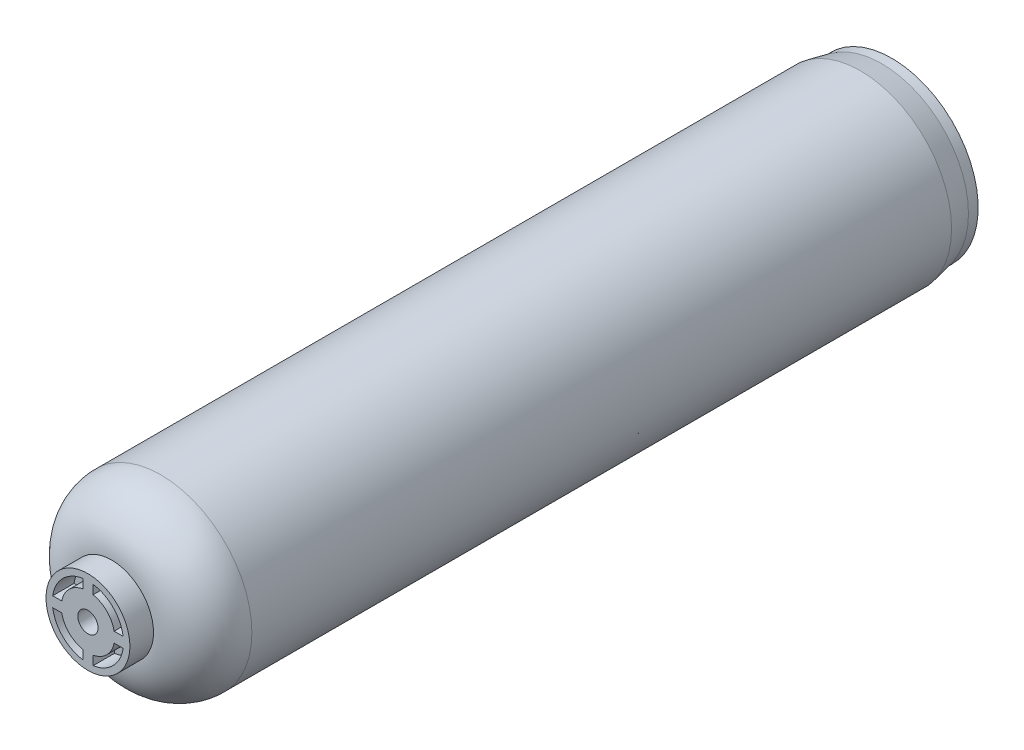
ISO-10303-21;
HEADER;
FILE_DESCRIPTION(('STEP AP214'),'2;1');
FILE_NAME('part.step','',(''),(''),'','','');
FILE_SCHEMA(('AUTOMOTIVE_DESIGN { 1 0 10303 214 1 1 1 1 }'));
ENDSEC;
DATA;
#1=APPLICATION_CONTEXT('core data for automotive mechanical design processes');
#2=APPLICATION_PROTOCOL_DEFINITION('international standard','automotive_design',2000,#1);
#3=PRODUCT_CONTEXT('',#1,'mechanical');
#4=PRODUCT('Part','Part','',(#3));
#5=PRODUCT_RELATED_PRODUCT_CATEGORY('part','',(#4));
#6=PRODUCT_DEFINITION_FORMATION('','',#4);
#7=PRODUCT_DEFINITION_CONTEXT('part definition',#1,'design');
#8=PRODUCT_DEFINITION('design','',#6,#7);
#9=PRODUCT_DEFINITION_SHAPE('','',#8);
#10=(LENGTH_UNIT() NAMED_UNIT(*) SI_UNIT(.MILLI.,.METRE.));
#11=(NAMED_UNIT(*) PLANE_ANGLE_UNIT() SI_UNIT($,.RADIAN.));
#12=(NAMED_UNIT(*) SI_UNIT($,.STERADIAN.) SOLID_ANGLE_UNIT());
#13=UNCERTAINTY_MEASURE_WITH_UNIT(LENGTH_MEASURE(1.E-05),#10,'distance_accuracy_value','');
#14=(GEOMETRIC_REPRESENTATION_CONTEXT(3) GLOBAL_UNCERTAINTY_ASSIGNED_CONTEXT((#13)) GLOBAL_UNIT_ASSIGNED_CONTEXT((#10,
#11,#12)) REPRESENTATION_CONTEXT('',''));
#15=CARTESIAN_POINT('',(0.,0.,0.));
#16=DIRECTION('',(0.,0.,1.));
#17=DIRECTION('',(1.,0.,0.));
#18=AXIS2_PLACEMENT_3D('',#15,#16,#17);
#19=CARTESIAN_POINT('',(0.,28.194,-273.742032584598));
#20=DIRECTION('',(0.,0.,-1.));
#21=DIRECTION('',(-1.,0.,0.));
#22=AXIS2_PLACEMENT_3D('',#19,#20,#21);
#23=PLANE('',#22);
#24=CARTESIAN_POINT('',(0.,0.,-273.742032584598));
#25=DIRECTION('',(0.,0.,-1.));
#26=DIRECTION('',(-1.,0.,0.));
#27=AXIS2_PLACEMENT_3D('',#24,#25,#26);
#28=CIRCLE('',#27,28.194);
#29=CARTESIAN_POINT('',(-28.194,0.,-273.742032584598));
#30=VERTEX_POINT('',#29);
#31=EDGE_CURVE('E316',#30,#30,#28,.T.);
#32=ORIENTED_EDGE('',*,*,#31,.T.);
#33=EDGE_LOOP('',(#32));
#34=FACE_BOUND('',#33,.T.);
#35=CARTESIAN_POINT('',(0.,0.,-273.742032584598));
#36=DIRECTION('',(0.,0.,-1.));
#37=DIRECTION('',(-1.,0.,0.));
#38=AXIS2_PLACEMENT_3D('',#35,#36,#37);
#39=CIRCLE('',#38,28.575);
#40=CARTESIAN_POINT('',(-28.575,0.,-273.742032584598));
#41=VERTEX_POINT('',#40);
#42=EDGE_CURVE('E313',#41,#41,#39,.F.);
#43=ORIENTED_EDGE('',*,*,#42,.T.);
#44=EDGE_LOOP('',(#43));
#45=FACE_BOUND('',#44,.T.);
#46=ADVANCED_FACE('F17',(#34,#45),#23,.F.);
#47=CARTESIAN_POINT('',(0.,0.,0.));
#48=DIRECTION('',(0.,0.,-1.));
#49=DIRECTION('',(-1.,0.,0.));
#50=AXIS2_PLACEMENT_3D('',#47,#48,#49);
#51=CYLINDRICAL_SURFACE('',#50,28.194);
#52=CARTESIAN_POINT('',(0.,0.,-279.584032584598));
#53=DIRECTION('',(0.,0.,-1.));
#54=DIRECTION('',(-1.,0.,0.));
#55=AXIS2_PLACEMENT_3D('',#52,#53,#54);
#56=CIRCLE('',#55,28.194);
#57=CARTESIAN_POINT('',(-28.194,0.,-279.584032584598));
#58=VERTEX_POINT('',#57);
#59=EDGE_CURVE('E310',#58,#58,#56,.T.);
#60=ORIENTED_EDGE('',*,*,#59,.T.);
#61=EDGE_LOOP('',(#60));
#62=FACE_BOUND('',#61,.T.);
#63=ORIENTED_EDGE('',*,*,#31,.F.);
#64=EDGE_LOOP('',(#63));
#65=FACE_BOUND('',#64,.T.);
#66=ADVANCED_FACE('F322',(#62,#65),#51,.F.);
#67=CARTESIAN_POINT('',(0.,0.,0.));
#68=DIRECTION('',(0.,0.,-1.));
#69=DIRECTION('',(-1.,0.,0.));
#70=AXIS2_PLACEMENT_3D('',#67,#68,#69);
#71=CYLINDRICAL_SURFACE('',#70,28.575);
#72=ORIENTED_EDGE('',*,*,#42,.F.);
#73=EDGE_LOOP('',(#72));
#74=FACE_BOUND('',#73,.T.);
#75=CARTESIAN_POINT('',(0.,0.,-271.329032584598));
#76=DIRECTION('',(0.,0.,-1.));
#77=DIRECTION('',(-1.,0.,0.));
#78=AXIS2_PLACEMENT_3D('',#75,#76,#77);
#79=CIRCLE('',#78,28.575);
#80=CARTESIAN_POINT('',(-28.575,0.,-271.329032584598));
#81=VERTEX_POINT('',#80);
#82=EDGE_CURVE('E307',#81,#81,#79,.F.);
#83=ORIENTED_EDGE('',*,*,#82,.T.);
#84=EDGE_LOOP('',(#83));
#85=FACE_BOUND('',#84,.T.);
#86=ADVANCED_FACE('F324',(#74,#85),#71,.F.);
#87=CARTESIAN_POINT('',(0.,28.575,-279.584032584598));
#88=DIRECTION('',(0.,0.,1.));
#89=DIRECTION('',(1.,0.,0.));
#90=AXIS2_PLACEMENT_3D('',#87,#88,#89);
#91=PLANE('',#90);
#92=ORIENTED_EDGE('',*,*,#59,.F.);
#93=EDGE_LOOP('',(#92));
#94=FACE_BOUND('',#93,.T.);
#95=CARTESIAN_POINT('',(0.,0.,-279.584032584598));
#96=DIRECTION('',(0.,0.,-1.));
#97=DIRECTION('',(-1.,0.,0.));
#98=AXIS2_PLACEMENT_3D('',#95,#96,#97);
#99=CIRCLE('',#98,28.575);
#100=CARTESIAN_POINT('',(-28.575,0.,-279.584032584598));
#101=VERTEX_POINT('',#100);
#102=EDGE_CURVE('E304',#101,#101,#99,.T.);
#103=ORIENTED_EDGE('',*,*,#102,.T.);
#104=EDGE_LOOP('',(#103));
#105=FACE_BOUND('',#104,.T.);
#106=ADVANCED_FACE('F331',(#94,#105),#91,.F.);
#107=CARTESIAN_POINT('',(0.,28.575,-271.329032584598));
#108=DIRECTION('',(0.,0.,1.));
#109=DIRECTION('',(1.,0.,0.));
#110=AXIS2_PLACEMENT_3D('',#107,#108,#109);
#111=PLANE('',#110);
#112=CARTESIAN_POINT('',(0.,0.,-271.329032584598));
#113=DIRECTION('',(0.,0.,-1.));
#114=DIRECTION('',(-1.,0.,0.));
#115=AXIS2_PLACEMENT_3D('',#112,#113,#114);
#116=CIRCLE('',#115,28.194);
#117=CARTESIAN_POINT('',(-28.194,0.,-271.329032584598));
#118=VERTEX_POINT('',#117);
#119=EDGE_CURVE('E301',#118,#118,#116,.F.);
#120=ORIENTED_EDGE('',*,*,#119,.T.);
#121=EDGE_LOOP('',(#120));
#122=FACE_BOUND('',#121,.T.);
#123=ORIENTED_EDGE('',*,*,#82,.F.);
#124=EDGE_LOOP('',(#123));
#125=FACE_BOUND('',#124,.T.);
#126=ADVANCED_FACE('F520',(#122,#125),#111,.F.);
#127=CARTESIAN_POINT('',(0.,0.,0.));
#128=DIRECTION('',(0.,0.,-1.));
#129=DIRECTION('',(-1.,0.,0.));
#130=AXIS2_PLACEMENT_3D('',#127,#128,#129);
#131=CYLINDRICAL_SURFACE('',#130,28.575);
#132=CARTESIAN_POINT('',(0.,0.,-283.648032584598));
#133=DIRECTION('',(0.,0.,-1.));
#134=DIRECTION('',(-1.,0.,0.));
#135=AXIS2_PLACEMENT_3D('',#132,#133,#134);
#136=CIRCLE('',#135,28.575);
#137=CARTESIAN_POINT('',(-28.575,0.,-283.648032584598));
#138=VERTEX_POINT('',#137);
#139=EDGE_CURVE('E239',#138,#138,#136,.T.);
#140=ORIENTED_EDGE('',*,*,#139,.T.);
#141=EDGE_LOOP('',(#140));
#142=FACE_BOUND('',#141,.T.);
#143=ORIENTED_EDGE('',*,*,#102,.F.);
#144=EDGE_LOOP('',(#143));
#145=FACE_BOUND('',#144,.T.);
#146=ADVANCED_FACE('F514',(#142,#145),#131,.F.);
#147=CARTESIAN_POINT('',(0.,0.,0.));
#148=DIRECTION('',(0.,0.,-1.));
#149=DIRECTION('',(-1.,0.,0.));
#150=AXIS2_PLACEMENT_3D('',#147,#148,#149);
#151=CYLINDRICAL_SURFACE('',#150,28.194);
#152=ORIENTED_EDGE('',*,*,#119,.F.);
#153=EDGE_LOOP('',(#152));
#154=FACE_BOUND('',#153,.T.);
#155=CARTESIAN_POINT('',(0.,0.,-25.9842));
#156=DIRECTION('',(0.,0.,1.));
#157=DIRECTION('',(1.,0.,0.));
#158=AXIS2_PLACEMENT_3D('',#155,#156,#157);
#159=CIRCLE('',#158,28.194);
#160=CARTESIAN_POINT('',(28.194,0.,-25.9842));
#161=VERTEX_POINT('',#160);
#162=EDGE_CURVE('E231',#161,#161,#159,.T.);
#163=ORIENTED_EDGE('',*,*,#162,.T.);
#164=EDGE_LOOP('',(#163));
#165=FACE_BOUND('',#164,.T.);
#166=ADVANCED_FACE('F509',(#154,#165),#151,.F.);
#167=CARTESIAN_POINT('',(0.,29.5275,-283.648032584598));
#168=DIRECTION('',(0.,0.,1.));
#169=DIRECTION('',(1.,0.,0.));
#170=AXIS2_PLACEMENT_3D('',#167,#168,#169);
#171=PLANE('',#170);
#172=ORIENTED_EDGE('',*,*,#139,.F.);
#173=EDGE_LOOP('',(#172));
#174=FACE_BOUND('',#173,.T.);
#175=CARTESIAN_POINT('',(0.,0.,-283.648032584598));
#176=DIRECTION('',(0.,0.,-1.));
#177=DIRECTION('',(-1.,0.,0.));
#178=AXIS2_PLACEMENT_3D('',#175,#176,#177);
#179=CIRCLE('',#178,29.5275);
#180=CARTESIAN_POINT('',(-29.5275,0.,-283.648032584598));
#181=VERTEX_POINT('',#180);
#182=EDGE_CURVE('E152',#181,#181,#179,.T.);
#183=ORIENTED_EDGE('',*,*,#182,.T.);
#184=EDGE_LOOP('',(#183));
#185=FACE_BOUND('',#184,.T.);
#186=ADVANCED_FACE('F223',(#174,#185),#171,.F.);
#187=CARTESIAN_POINT('',(0.,0.,-25.9842));
#188=DIRECTION('',(0.,0.,1.));
#189=DIRECTION('',(1.,0.,0.));
#190=AXIS2_PLACEMENT_3D('',#187,#188,#189);
#191=TOROIDAL_SURFACE('',#190,14.9606,13.2334);
#192=ORIENTED_EDGE('',*,*,#162,.F.);
#193=EDGE_LOOP('',(#192));
#194=FACE_BOUND('',#193,.T.);
#195=CARTESIAN_POINT('',(0.,0.,-12.7508));
#196=DIRECTION('',(0.,0.,1.));
#197=DIRECTION('',(-1.,0.,0.));
#198=AXIS2_PLACEMENT_3D('',#195,#196,#197);
#199=CIRCLE('',#198,14.9606);
#200=CARTESIAN_POINT('',(-14.9606,0.,-12.7508));
#201=VERTEX_POINT('',#200);
#202=CARTESIAN_POINT('',(14.9606,0.,-12.7508));
#203=VERTEX_POINT('',#202);
#204=EDGE_CURVE('E139',#201,#203,#199,.T.);
#205=ORIENTED_EDGE('',*,*,#204,.T.);
#206=CARTESIAN_POINT('',(0.,0.,-12.7508));
#207=DIRECTION('',(0.,0.,1.));
#208=DIRECTION('',(1.,0.,0.));
#209=AXIS2_PLACEMENT_3D('',#206,#207,#208);
#210=CIRCLE('',#209,14.9606);
#211=EDGE_CURVE('E142',#203,#201,#210,.T.);
#212=ORIENTED_EDGE('',*,*,#211,.T.);
#213=EDGE_LOOP('',(#205,#212));
#214=FACE_BOUND('',#213,.T.);
#215=ADVANCED_FACE('F144',(#194,#214),#191,.F.);
#216=CARTESIAN_POINT('',(0.,0.,0.));
#217=DIRECTION('',(0.,0.,-1.));
#218=DIRECTION('',(-1.,0.,0.));
#219=AXIS2_PLACEMENT_3D('',#216,#217,#218);
#220=CYLINDRICAL_SURFACE('',#219,29.5275);
#221=CARTESIAN_POINT('',(0.,0.,-286.823032584598));
#222=DIRECTION('',(0.,0.,1.));
#223=DIRECTION('',(1.,0.,0.));
#224=AXIS2_PLACEMENT_3D('',#221,#222,#223);
#225=CIRCLE('',#224,29.5275);
#226=CARTESIAN_POINT('',(29.5275,0.,-286.823032584598));
#227=VERTEX_POINT('',#226);
#228=EDGE_CURVE('E147',#227,#227,#225,.T.);
#229=ORIENTED_EDGE('',*,*,#228,.F.);
#230=EDGE_LOOP('',(#229));
#231=FACE_BOUND('',#230,.T.);
#232=ORIENTED_EDGE('',*,*,#182,.F.);
#233=EDGE_LOOP('',(#232));
#234=FACE_BOUND('',#233,.T.);
#235=ADVANCED_FACE('F222',(#231,#234),#220,.F.);
#236=CARTESIAN_POINT('',(0.,0.,-7.62));
#237=DIRECTION('',(0.,0.,1.));
#238=DIRECTION('',(1.,0.,0.));
#239=AXIS2_PLACEMENT_3D('',#236,#237,#238);
#240=PLANE('',#239);
#241=CARTESIAN_POINT('',(0.,0.,-7.62));
#242=DIRECTION('',(0.,0.,-1.));
#243=DIRECTION('',(-1.,0.,0.));
#244=AXIS2_PLACEMENT_3D('',#241,#242,#243);
#245=CIRCLE('',#244,9.525);
#246=CARTESIAN_POINT('',(9.34529307994137,1.8415,-7.62));
#247=VERTEX_POINT('',#246);
#248=CARTESIAN_POINT('',(1.8415,9.34529307994136,-7.62));
#249=VERTEX_POINT('',#248);
#250=EDGE_CURVE('E132',#247,#249,#245,.F.);
#251=ORIENTED_EDGE('',*,*,#250,.F.);
#252=DIRECTION('',(1.,0.,0.));
#253=VECTOR('',#252,1.);
#254=CARTESIAN_POINT('',(9.34529307994137,1.8415,-7.62));
#255=LINE('',#254,#253);
#256=CARTESIAN_POINT('',(12.5657820190388,1.8415,-7.62));
#257=VERTEX_POINT('',#256);
#258=EDGE_CURVE('E212',#247,#257,#255,.T.);
#259=ORIENTED_EDGE('',*,*,#258,.T.);
#260=CARTESIAN_POINT('',(0.,0.,-7.62));
#261=DIRECTION('',(0.,0.,-1.));
#262=DIRECTION('',(-1.,0.,0.));
#263=AXIS2_PLACEMENT_3D('',#260,#261,#262);
#264=CIRCLE('',#263,12.7);
#265=CARTESIAN_POINT('',(1.8415,12.5657820190388,-7.62));
#266=VERTEX_POINT('',#265);
#267=EDGE_CURVE('E294',#257,#266,#264,.F.);
#268=ORIENTED_EDGE('',*,*,#267,.T.);
#269=DIRECTION('',(0.,1.,0.));
#270=VECTOR('',#269,1.);
#271=CARTESIAN_POINT('',(1.8415,12.5657820190388,-7.62));
#272=LINE('',#271,#270);
#273=EDGE_CURVE('E208',#266,#249,#272,.F.);
#274=ORIENTED_EDGE('',*,*,#273,.T.);
#275=EDGE_LOOP('',(#251,#259,#268,#274));
#276=FACE_BOUND('',#275,.T.);
#277=ADVANCED_FACE('F400',(#276),#240,.T.);
#278=CARTESIAN_POINT('',(0.,0.,-7.62));
#279=DIRECTION('',(0.,0.,1.));
#280=DIRECTION('',(1.,0.,0.));
#281=AXIS2_PLACEMENT_3D('',#278,#279,#280);
#282=PLANE('',#281);
#283=CARTESIAN_POINT('',(0.,0.,-7.62));
#284=DIRECTION('',(0.,0.,-1.));
#285=DIRECTION('',(-1.,0.,0.));
#286=AXIS2_PLACEMENT_3D('',#283,#284,#285);
#287=CIRCLE('',#286,9.525);
#288=CARTESIAN_POINT('',(1.8415,-9.34529307994136,-7.62));
#289=VERTEX_POINT('',#288);
#290=CARTESIAN_POINT('',(9.34529307994137,-1.8415,-7.62));
#291=VERTEX_POINT('',#290);
#292=EDGE_CURVE('E291',#289,#291,#287,.F.);
#293=ORIENTED_EDGE('',*,*,#292,.F.);
#294=DIRECTION('',(0.,-1.,0.));
#295=VECTOR('',#294,1.);
#296=CARTESIAN_POINT('',(1.8415,-9.34529307994136,-7.62));
#297=LINE('',#296,#295);
#298=CARTESIAN_POINT('',(1.84150000000001,-12.5657820190388,-7.62));
#299=VERTEX_POINT('',#298);
#300=EDGE_CURVE('E204',#289,#299,#297,.T.);
#301=ORIENTED_EDGE('',*,*,#300,.T.);
#302=CARTESIAN_POINT('',(0.,0.,-7.62));
#303=DIRECTION('',(0.,0.,-1.));
#304=DIRECTION('',(-1.,0.,0.));
#305=AXIS2_PLACEMENT_3D('',#302,#303,#304);
#306=CIRCLE('',#305,12.7);
#307=CARTESIAN_POINT('',(12.5657820190388,-1.8415,-7.62));
#308=VERTEX_POINT('',#307);
#309=EDGE_CURVE('E289',#299,#308,#306,.F.);
#310=ORIENTED_EDGE('',*,*,#309,.T.);
#311=DIRECTION('',(1.,0.,0.));
#312=VECTOR('',#311,1.);
#313=CARTESIAN_POINT('',(9.34529307994137,-1.8415,-7.62));
#314=LINE('',#313,#312);
#315=EDGE_CURVE('E200',#308,#291,#314,.F.);
#316=ORIENTED_EDGE('',*,*,#315,.T.);
#317=EDGE_LOOP('',(#293,#301,#310,#316));
#318=FACE_BOUND('',#317,.T.);
#319=ADVANCED_FACE('F579',(#318),#282,.T.);
#320=CARTESIAN_POINT('',(0.,0.,-7.62));
#321=DIRECTION('',(0.,0.,1.));
#322=DIRECTION('',(1.,0.,0.));
#323=AXIS2_PLACEMENT_3D('',#320,#321,#322);
#324=PLANE('',#323);
#325=CARTESIAN_POINT('',(0.,0.,-7.62));
#326=DIRECTION('',(0.,0.,-1.));
#327=DIRECTION('',(-1.,0.,0.));
#328=AXIS2_PLACEMENT_3D('',#325,#326,#327);
#329=CIRCLE('',#328,12.7);
#330=CARTESIAN_POINT('',(-12.5657820190388,-1.8415,-7.62));
#331=VERTEX_POINT('',#330);
#332=CARTESIAN_POINT('',(-1.8415,-12.5657820190388,-7.62));
#333=VERTEX_POINT('',#332);
#334=EDGE_CURVE('E287',#331,#333,#329,.F.);
#335=ORIENTED_EDGE('',*,*,#334,.T.);
#336=DIRECTION('',(0.,1.,0.));
#337=VECTOR('',#336,1.);
#338=CARTESIAN_POINT('',(-1.8415,-9.34529307994136,-7.62));
#339=LINE('',#338,#337);
#340=CARTESIAN_POINT('',(-1.8415,-9.34529307994137,-7.62));
#341=VERTEX_POINT('',#340);
#342=EDGE_CURVE('E196',#333,#341,#339,.T.);
#343=ORIENTED_EDGE('',*,*,#342,.T.);
#344=CARTESIAN_POINT('',(0.,0.,-7.62));
#345=DIRECTION('',(0.,0.,-1.));
#346=DIRECTION('',(-1.,0.,0.));
#347=AXIS2_PLACEMENT_3D('',#344,#345,#346);
#348=CIRCLE('',#347,9.525);
#349=CARTESIAN_POINT('',(-9.34529307994137,-1.8415,-7.62));
#350=VERTEX_POINT('',#349);
#351=EDGE_CURVE('E198',#350,#341,#348,.F.);
#352=ORIENTED_EDGE('',*,*,#351,.F.);
#353=DIRECTION('',(1.,0.,0.));
#354=VECTOR('',#353,1.);
#355=CARTESIAN_POINT('',(-12.5657820190388,-1.8415,-7.62));
#356=LINE('',#355,#354);
#357=EDGE_CURVE('E192',#350,#331,#356,.F.);
#358=ORIENTED_EDGE('',*,*,#357,.T.);
#359=EDGE_LOOP('',(#335,#343,#352,#358));
#360=FACE_BOUND('',#359,.T.);
#361=ADVANCED_FACE('F587',(#360),#324,.T.);
#362=CARTESIAN_POINT('',(0.,0.,-7.62));
#363=DIRECTION('',(0.,0.,1.));
#364=DIRECTION('',(1.,0.,0.));
#365=AXIS2_PLACEMENT_3D('',#362,#363,#364);
#366=PLANE('',#365);
#367=CARTESIAN_POINT('',(0.,0.,-7.62));
#368=DIRECTION('',(0.,0.,-1.));
#369=DIRECTION('',(-1.,0.,0.));
#370=AXIS2_PLACEMENT_3D('',#367,#368,#369);
#371=CIRCLE('',#370,12.7);
#372=CARTESIAN_POINT('',(-1.8415,12.5657820190388,-7.62));
#373=VERTEX_POINT('',#372);
#374=CARTESIAN_POINT('',(-12.5657820190388,1.8415,-7.62));
#375=VERTEX_POINT('',#374);
#376=EDGE_CURVE('E282',#373,#375,#371,.F.);
#377=ORIENTED_EDGE('',*,*,#376,.T.);
#378=DIRECTION('',(1.,0.,0.));
#379=VECTOR('',#378,1.);
#380=CARTESIAN_POINT('',(-12.5657820190388,1.8415,-7.62));
#381=LINE('',#380,#379);
#382=CARTESIAN_POINT('',(-9.34529307994137,1.8415,-7.62));
#383=VERTEX_POINT('',#382);
#384=EDGE_CURVE('E188',#375,#383,#381,.T.);
#385=ORIENTED_EDGE('',*,*,#384,.T.);
#386=CARTESIAN_POINT('',(0.,0.,-7.62));
#387=DIRECTION('',(0.,0.,-1.));
#388=DIRECTION('',(-1.,0.,0.));
#389=AXIS2_PLACEMENT_3D('',#386,#387,#388);
#390=CIRCLE('',#389,9.525);
#391=CARTESIAN_POINT('',(-1.8415,9.34529307994136,-7.62));
#392=VERTEX_POINT('',#391);
#393=EDGE_CURVE('E190',#392,#383,#390,.F.);
#394=ORIENTED_EDGE('',*,*,#393,.F.);
#395=DIRECTION('',(0.,1.,0.));
#396=VECTOR('',#395,1.);
#397=CARTESIAN_POINT('',(-1.8415,12.5657820190388,-7.62));
#398=LINE('',#397,#396);
#399=EDGE_CURVE('E179',#392,#373,#398,.T.);
#400=ORIENTED_EDGE('',*,*,#399,.T.);
#401=EDGE_LOOP('',(#377,#385,#394,#400));
#402=FACE_BOUND('',#401,.T.);
#403=ADVANCED_FACE('F171',(#402),#366,.T.);
#404=CARTESIAN_POINT('',(0.,14.9606,-12.7508));
#405=DIRECTION('',(0.,0.,1.));
#406=DIRECTION('',(1.,0.,0.));
#407=AXIS2_PLACEMENT_3D('',#404,#405,#406);
#408=PLANE('',#407);
#409=CARTESIAN_POINT('',(0.,0.,-12.7508));
#410=DIRECTION('',(0.,0.,-1.));
#411=DIRECTION('',(-1.,0.,0.));
#412=AXIS2_PLACEMENT_3D('',#409,#410,#411);
#413=CIRCLE('',#412,3.6195);
#414=CARTESIAN_POINT('',(-3.6195,0.,-12.7508));
#415=VERTEX_POINT('',#414);
#416=EDGE_CURVE('E276',#415,#415,#413,.F.);
#417=ORIENTED_EDGE('',*,*,#416,.T.);
#418=EDGE_LOOP('',(#417));
#419=FACE_BOUND('',#418,.T.);
#420=ORIENTED_EDGE('',*,*,#204,.F.);
#421=ORIENTED_EDGE('',*,*,#211,.F.);
#422=EDGE_LOOP('',(#420,#421));
#423=FACE_BOUND('',#422,.T.);
#424=ADVANCED_FACE('F151',(#419,#423),#408,.F.);
#425=CARTESIAN_POINT('',(0.,0.,-286.813020570637));
#426=DIRECTION('',(0.,0.,1.));
#427=DIRECTION('',(1.,0.,0.));
#428=AXIS2_PLACEMENT_3D('',#425,#426,#427);
#429=CONICAL_SURFACE('',#428,30.7975,1.56291301454651);
#430=CARTESIAN_POINT('',(0.,0.,-286.813020570637));
#431=DIRECTION('',(0.,0.,-1.));
#432=DIRECTION('',(-1.,0.,0.));
#433=AXIS2_PLACEMENT_3D('',#430,#431,#432);
#434=CIRCLE('',#433,30.7975);
#435=CARTESIAN_POINT('',(-30.7975,0.,-286.813020570637));
#436=VERTEX_POINT('',#435);
#437=EDGE_CURVE('E155',#436,#436,#434,.F.);
#438=ORIENTED_EDGE('',*,*,#437,.F.);
#439=EDGE_LOOP('',(#438));
#440=FACE_BOUND('',#439,.T.);
#441=ORIENTED_EDGE('',*,*,#228,.T.);
#442=EDGE_LOOP('',(#441));
#443=FACE_BOUND('',#442,.T.);
#444=ADVANCED_FACE('F170',(#440,#443),#429,.T.);
#445=CARTESIAN_POINT('',(0.,0.,-7.62));
#446=DIRECTION('',(0.,0.,-1.));
#447=DIRECTION('',(-1.,0.,0.));
#448=AXIS2_PLACEMENT_3D('',#445,#446,#447);
#449=CYLINDRICAL_SURFACE('',#448,9.525);
#450=ORIENTED_EDGE('',*,*,#250,.T.);
#451=DIRECTION('',(0.,0.,1.));
#452=VECTOR('',#451,1.);
#453=CARTESIAN_POINT('',(1.8415,9.34529307994136,-7.62));
#454=LINE('',#453,#452);
#455=CARTESIAN_POINT('',(1.8415,9.34529307994136,0.));
#456=VERTEX_POINT('',#455);
#457=EDGE_CURVE('E210',#249,#456,#454,.T.);
#458=ORIENTED_EDGE('',*,*,#457,.T.);
#459=CARTESIAN_POINT('',(0.,0.,0.));
#460=DIRECTION('',(0.,0.,-1.));
#461=DIRECTION('',(-1.,0.,0.));
#462=AXIS2_PLACEMENT_3D('',#459,#460,#461);
#463=CIRCLE('',#462,9.525);
#464=CARTESIAN_POINT('',(9.34529307994137,1.8415,0.));
#465=VERTEX_POINT('',#464);
#466=EDGE_CURVE('E274',#456,#465,#463,.T.);
#467=ORIENTED_EDGE('',*,*,#466,.T.);
#468=DIRECTION('',(0.,0.,-1.));
#469=VECTOR('',#468,1.);
#470=CARTESIAN_POINT('',(9.34529307994137,1.8415,-7.62));
#471=LINE('',#470,#469);
#472=EDGE_CURVE('E215',#465,#247,#471,.T.);
#473=ORIENTED_EDGE('',*,*,#472,.T.);
#474=EDGE_LOOP('',(#450,#458,#467,#473));
#475=FACE_BOUND('',#474,.T.);
#476=ADVANCED_FACE('F392',(#475),#449,.T.);
#477=CARTESIAN_POINT('',(9.34529307994137,1.8415,-7.62));
#478=DIRECTION('',(0.,-1.,0.));
#479=DIRECTION('',(0.,0.,-1.));
#480=AXIS2_PLACEMENT_3D('',#477,#478,#479);
#481=PLANE('',#480);
#482=DIRECTION('',(0.,0.,-1.));
#483=VECTOR('',#482,1.);
#484=CARTESIAN_POINT('',(12.5657820190388,1.8415,-7.62));
#485=LINE('',#484,#483);
#486=CARTESIAN_POINT('',(12.5657820190388,1.8415,0.));
#487=VERTEX_POINT('',#486);
#488=EDGE_CURVE('E214',#487,#257,#485,.T.);
#489=ORIENTED_EDGE('',*,*,#488,.T.);
#490=ORIENTED_EDGE('',*,*,#258,.F.);
#491=ORIENTED_EDGE('',*,*,#472,.F.);
#492=DIRECTION('',(-1.,0.,0.));
#493=VECTOR('',#492,1.);
#494=CARTESIAN_POINT('',(0.,1.8415,0.));
#495=LINE('',#494,#493);
#496=EDGE_CURVE('E273',#465,#487,#495,.F.);
#497=ORIENTED_EDGE('',*,*,#496,.T.);
#498=EDGE_LOOP('',(#489,#490,#491,#497));
#499=FACE_BOUND('',#498,.T.);
#500=ADVANCED_FACE('F397',(#499),#481,.F.);
#501=CARTESIAN_POINT('',(0.,0.,-7.62));
#502=DIRECTION('',(0.,0.,-1.));
#503=DIRECTION('',(-1.,0.,0.));
#504=AXIS2_PLACEMENT_3D('',#501,#502,#503);
#505=CYLINDRICAL_SURFACE('',#504,12.7);
#506=DIRECTION('',(0.,0.,1.));
#507=VECTOR('',#506,1.);
#508=CARTESIAN_POINT('',(1.8415,12.5657820190388,-7.62));
#509=LINE('',#508,#507);
#510=CARTESIAN_POINT('',(1.8415,12.5657820190388,0.));
#511=VERTEX_POINT('',#510);
#512=EDGE_CURVE('E211',#511,#266,#509,.F.);
#513=ORIENTED_EDGE('',*,*,#512,.T.);
#514=ORIENTED_EDGE('',*,*,#267,.F.);
#515=ORIENTED_EDGE('',*,*,#488,.F.);
#516=CARTESIAN_POINT('',(0.,0.,0.));
#517=DIRECTION('',(0.,0.,-1.));
#518=DIRECTION('',(-1.,0.,0.));
#519=AXIS2_PLACEMENT_3D('',#516,#517,#518);
#520=CIRCLE('',#519,12.7);
#521=EDGE_CURVE('E271',#487,#511,#520,.F.);
#522=ORIENTED_EDGE('',*,*,#521,.T.);
#523=EDGE_LOOP('',(#513,#514,#515,#522));
#524=FACE_BOUND('',#523,.T.);
#525=ADVANCED_FACE('F404',(#524),#505,.F.);
#526=CARTESIAN_POINT('',(1.8415,12.5657820190388,-7.62));
#527=DIRECTION('',(-1.,0.,0.));
#528=DIRECTION('',(0.,0.,1.));
#529=AXIS2_PLACEMENT_3D('',#526,#527,#528);
#530=PLANE('',#529);
#531=ORIENTED_EDGE('',*,*,#457,.F.);
#532=ORIENTED_EDGE('',*,*,#273,.F.);
#533=ORIENTED_EDGE('',*,*,#512,.F.);
#534=DIRECTION('',(0.,1.,0.));
#535=VECTOR('',#534,1.);
#536=CARTESIAN_POINT('',(1.8415,3.6195,0.));
#537=LINE('',#536,#535);
#538=EDGE_CURVE('E270',#511,#456,#537,.F.);
#539=ORIENTED_EDGE('',*,*,#538,.T.);
#540=EDGE_LOOP('',(#531,#532,#533,#539));
#541=FACE_BOUND('',#540,.T.);
#542=ADVANCED_FACE('F408',(#541),#530,.F.);
#543=CARTESIAN_POINT('',(0.,0.,-7.62));
#544=DIRECTION('',(0.,0.,-1.));
#545=DIRECTION('',(-1.,0.,0.));
#546=AXIS2_PLACEMENT_3D('',#543,#544,#545);
#547=CYLINDRICAL_SURFACE('',#546,9.525);
#548=ORIENTED_EDGE('',*,*,#292,.T.);
#549=DIRECTION('',(0.,0.,1.));
#550=VECTOR('',#549,1.);
#551=CARTESIAN_POINT('',(9.34529307994137,-1.8415,-7.62));
#552=LINE('',#551,#550);
#553=CARTESIAN_POINT('',(9.34529307994137,-1.8415,0.));
#554=VERTEX_POINT('',#553);
#555=EDGE_CURVE('E202',#291,#554,#552,.T.);
#556=ORIENTED_EDGE('',*,*,#555,.T.);
#557=CARTESIAN_POINT('',(0.,0.,0.));
#558=DIRECTION('',(0.,0.,-1.));
#559=DIRECTION('',(-1.,0.,0.));
#560=AXIS2_PLACEMENT_3D('',#557,#558,#559);
#561=CIRCLE('',#560,9.525);
#562=CARTESIAN_POINT('',(1.8415,-9.34529307994136,0.));
#563=VERTEX_POINT('',#562);
#564=EDGE_CURVE('E268',#554,#563,#561,.T.);
#565=ORIENTED_EDGE('',*,*,#564,.T.);
#566=DIRECTION('',(0.,0.,1.));
#567=VECTOR('',#566,1.);
#568=CARTESIAN_POINT('',(1.8415,-9.34529307994136,-7.62));
#569=LINE('',#568,#567);
#570=EDGE_CURVE('E207',#563,#289,#569,.F.);
#571=ORIENTED_EDGE('',*,*,#570,.T.);
#572=EDGE_LOOP('',(#548,#556,#565,#571));
#573=FACE_BOUND('',#572,.T.);
#574=ADVANCED_FACE('F482',(#573),#547,.T.);
#575=CARTESIAN_POINT('',(1.8415,-9.34529307994136,-7.62));
#576=DIRECTION('',(-1.,0.,0.));
#577=DIRECTION('',(0.,-1.,0.));
#578=AXIS2_PLACEMENT_3D('',#575,#576,#577);
#579=PLANE('',#578);
#580=DIRECTION('',(0.,0.,-1.));
#581=VECTOR('',#580,1.);
#582=CARTESIAN_POINT('',(1.84150000000002,-12.5657820190388,-7.62));
#583=LINE('',#582,#581);
#584=CARTESIAN_POINT('',(1.84150000000001,-12.5657820190388,0.));
#585=VERTEX_POINT('',#584);
#586=EDGE_CURVE('E206',#585,#299,#583,.T.);
#587=ORIENTED_EDGE('',*,*,#586,.T.);
#588=ORIENTED_EDGE('',*,*,#300,.F.);
#589=ORIENTED_EDGE('',*,*,#570,.F.);
#590=DIRECTION('',(0.,1.,0.));
#591=VECTOR('',#590,1.);
#592=CARTESIAN_POINT('',(1.8415,3.6195,0.));
#593=LINE('',#592,#591);
#594=EDGE_CURVE('E267',#563,#585,#593,.F.);
#595=ORIENTED_EDGE('',*,*,#594,.T.);
#596=EDGE_LOOP('',(#587,#588,#589,#595));
#597=FACE_BOUND('',#596,.T.);
#598=ADVANCED_FACE('F478',(#597),#579,.F.);
#599=CARTESIAN_POINT('',(0.,0.,-7.62));
#600=DIRECTION('',(0.,0.,-1.));
#601=DIRECTION('',(-1.,0.,0.));
#602=AXIS2_PLACEMENT_3D('',#599,#600,#601);
#603=CYLINDRICAL_SURFACE('',#602,12.7);
#604=DIRECTION('',(0.,0.,1.));
#605=VECTOR('',#604,1.);
#606=CARTESIAN_POINT('',(12.5657820190388,-1.8415,-7.62));
#607=LINE('',#606,#605);
#608=CARTESIAN_POINT('',(12.5657820190388,-1.8415,0.));
#609=VERTEX_POINT('',#608);
#610=EDGE_CURVE('E203',#609,#308,#607,.F.);
#611=ORIENTED_EDGE('',*,*,#610,.T.);
#612=ORIENTED_EDGE('',*,*,#309,.F.);
#613=ORIENTED_EDGE('',*,*,#586,.F.);
#614=CARTESIAN_POINT('',(0.,0.,0.));
#615=DIRECTION('',(0.,0.,-1.));
#616=DIRECTION('',(-1.,0.,0.));
#617=AXIS2_PLACEMENT_3D('',#614,#615,#616);
#618=CIRCLE('',#617,12.7);
#619=EDGE_CURVE('E265',#585,#609,#618,.F.);
#620=ORIENTED_EDGE('',*,*,#619,.T.);
#621=EDGE_LOOP('',(#611,#612,#613,#620));
#622=FACE_BOUND('',#621,.T.);
#623=ADVANCED_FACE('F474',(#622),#603,.F.);
#624=CARTESIAN_POINT('',(9.34529307994137,-1.8415,-7.62));
#625=DIRECTION('',(0.,1.,0.));
#626=DIRECTION('',(0.,0.,1.));
#627=AXIS2_PLACEMENT_3D('',#624,#625,#626);
#628=PLANE('',#627);
#629=ORIENTED_EDGE('',*,*,#555,.F.);
#630=ORIENTED_EDGE('',*,*,#315,.F.);
#631=ORIENTED_EDGE('',*,*,#610,.F.);
#632=DIRECTION('',(-1.,0.,0.));
#633=VECTOR('',#632,1.);
#634=CARTESIAN_POINT('',(0.,-1.8415,0.));
#635=LINE('',#634,#633);
#636=EDGE_CURVE('E264',#609,#554,#635,.T.);
#637=ORIENTED_EDGE('',*,*,#636,.T.);
#638=EDGE_LOOP('',(#629,#630,#631,#637));
#639=FACE_BOUND('',#638,.T.);
#640=ADVANCED_FACE('F470',(#639),#628,.F.);
#641=CARTESIAN_POINT('',(0.,0.,-7.62));
#642=DIRECTION('',(0.,0.,-1.));
#643=DIRECTION('',(-1.,0.,0.));
#644=AXIS2_PLACEMENT_3D('',#641,#642,#643);
#645=CYLINDRICAL_SURFACE('',#644,12.7);
#646=DIRECTION('',(0.,0.,-1.));
#647=VECTOR('',#646,1.);
#648=CARTESIAN_POINT('',(-1.8415,-12.5657820190388,-7.62));
#649=LINE('',#648,#647);
#650=CARTESIAN_POINT('',(-1.84150000000001,-12.5657820190388,0.));
#651=VERTEX_POINT('',#650);
#652=EDGE_CURVE('E199',#651,#333,#649,.T.);
#653=ORIENTED_EDGE('',*,*,#652,.T.);
#654=ORIENTED_EDGE('',*,*,#334,.F.);
#655=DIRECTION('',(0.,0.,1.));
#656=VECTOR('',#655,1.);
#657=CARTESIAN_POINT('',(-12.5657820190388,-1.8415,-7.62));
#658=LINE('',#657,#656);
#659=CARTESIAN_POINT('',(-12.5657820190388,-1.8415,0.));
#660=VERTEX_POINT('',#659);
#661=EDGE_CURVE('E194',#331,#660,#658,.T.);
#662=ORIENTED_EDGE('',*,*,#661,.T.);
#663=CARTESIAN_POINT('',(0.,0.,0.));
#664=DIRECTION('',(0.,0.,-1.));
#665=DIRECTION('',(-1.,0.,0.));
#666=AXIS2_PLACEMENT_3D('',#663,#664,#665);
#667=CIRCLE('',#666,12.7);
#668=EDGE_CURVE('E262',#660,#651,#667,.F.);
#669=ORIENTED_EDGE('',*,*,#668,.T.);
#670=EDGE_LOOP('',(#653,#654,#662,#669));
#671=FACE_BOUND('',#670,.T.);
#672=ADVANCED_FACE('F466',(#671),#645,.F.);
#673=CARTESIAN_POINT('',(-1.8415,-9.34529307994136,-7.62));
#674=DIRECTION('',(1.,0.,0.));
#675=DIRECTION('',(0.,0.,-1.));
#676=AXIS2_PLACEMENT_3D('',#673,#674,#675);
#677=PLANE('',#676);
#678=DIRECTION('',(0.,0.,-1.));
#679=VECTOR('',#678,1.);
#680=CARTESIAN_POINT('',(-1.8415,-9.34529307994137,-7.62));
#681=LINE('',#680,#679);
#682=CARTESIAN_POINT('',(-1.8415,-9.34529307994137,0.));
#683=VERTEX_POINT('',#682);
#684=EDGE_CURVE('E286',#341,#683,#681,.F.);
#685=ORIENTED_EDGE('',*,*,#684,.F.);
#686=ORIENTED_EDGE('',*,*,#342,.F.);
#687=ORIENTED_EDGE('',*,*,#652,.F.);
#688=DIRECTION('',(0.,1.,0.));
#689=VECTOR('',#688,1.);
#690=CARTESIAN_POINT('',(-1.84150000000001,3.6195,0.));
#691=LINE('',#690,#689);
#692=EDGE_CURVE('E261',#651,#683,#691,.T.);
#693=ORIENTED_EDGE('',*,*,#692,.T.);
#694=EDGE_LOOP('',(#685,#686,#687,#693));
#695=FACE_BOUND('',#694,.T.);
#696=ADVANCED_FACE('F462',(#695),#677,.F.);
#697=CARTESIAN_POINT('',(0.,0.,-7.62));
#698=DIRECTION('',(0.,0.,-1.));
#699=DIRECTION('',(-1.,0.,0.));
#700=AXIS2_PLACEMENT_3D('',#697,#698,#699);
#701=CYLINDRICAL_SURFACE('',#700,9.525);
#702=ORIENTED_EDGE('',*,*,#351,.T.);
#703=ORIENTED_EDGE('',*,*,#684,.T.);
#704=CARTESIAN_POINT('',(0.,0.,0.));
#705=DIRECTION('',(0.,0.,-1.));
#706=DIRECTION('',(-1.,0.,0.));
#707=AXIS2_PLACEMENT_3D('',#704,#705,#706);
#708=CIRCLE('',#707,9.525);
#709=CARTESIAN_POINT('',(-9.34529307994137,-1.8415,0.));
#710=VERTEX_POINT('',#709);
#711=EDGE_CURVE('E259',#683,#710,#708,.T.);
#712=ORIENTED_EDGE('',*,*,#711,.T.);
#713=DIRECTION('',(0.,0.,1.));
#714=VECTOR('',#713,1.);
#715=CARTESIAN_POINT('',(-9.34529307994137,-1.8415,-7.62));
#716=LINE('',#715,#714);
#717=EDGE_CURVE('E195',#710,#350,#716,.F.);
#718=ORIENTED_EDGE('',*,*,#717,.T.);
#719=EDGE_LOOP('',(#702,#703,#712,#718));
#720=FACE_BOUND('',#719,.T.);
#721=ADVANCED_FACE('F458',(#720),#701,.T.);
#722=CARTESIAN_POINT('',(-12.5657820190388,-1.8415,-7.62));
#723=DIRECTION('',(0.,1.,0.));
#724=DIRECTION('',(0.,0.,1.));
#725=AXIS2_PLACEMENT_3D('',#722,#723,#724);
#726=PLANE('',#725);
#727=ORIENTED_EDGE('',*,*,#661,.F.);
#728=ORIENTED_EDGE('',*,*,#357,.F.);
#729=ORIENTED_EDGE('',*,*,#717,.F.);
#730=DIRECTION('',(-1.,0.,0.));
#731=VECTOR('',#730,1.);
#732=CARTESIAN_POINT('',(0.,-1.8415,0.));
#733=LINE('',#732,#731);
#734=EDGE_CURVE('E258',#710,#660,#733,.T.);
#735=ORIENTED_EDGE('',*,*,#734,.T.);
#736=EDGE_LOOP('',(#727,#728,#729,#735));
#737=FACE_BOUND('',#736,.T.);
#738=ADVANCED_FACE('F454',(#737),#726,.F.);
#739=CARTESIAN_POINT('',(0.,0.,-7.62));
#740=DIRECTION('',(0.,0.,-1.));
#741=DIRECTION('',(-1.,0.,0.));
#742=AXIS2_PLACEMENT_3D('',#739,#740,#741);
#743=CYLINDRICAL_SURFACE('',#742,12.7);
#744=DIRECTION('',(0.,0.,-1.));
#745=VECTOR('',#744,1.);
#746=CARTESIAN_POINT('',(-12.5657820190388,1.8415,-7.62));
#747=LINE('',#746,#745);
#748=CARTESIAN_POINT('',(-12.5657820190388,1.8415,0.));
#749=VERTEX_POINT('',#748);
#750=EDGE_CURVE('E191',#749,#375,#747,.T.);
#751=ORIENTED_EDGE('',*,*,#750,.T.);
#752=ORIENTED_EDGE('',*,*,#376,.F.);
#753=DIRECTION('',(0.,0.,-1.));
#754=VECTOR('',#753,1.);
#755=CARTESIAN_POINT('',(-1.8415,12.5657820190388,-7.62));
#756=LINE('',#755,#754);
#757=CARTESIAN_POINT('',(-1.8415,12.5657820190388,0.));
#758=VERTEX_POINT('',#757);
#759=EDGE_CURVE('E186',#373,#758,#756,.F.);
#760=ORIENTED_EDGE('',*,*,#759,.T.);
#761=CARTESIAN_POINT('',(0.,0.,0.));
#762=DIRECTION('',(0.,0.,-1.));
#763=DIRECTION('',(-1.,0.,0.));
#764=AXIS2_PLACEMENT_3D('',#761,#762,#763);
#765=CIRCLE('',#764,12.7);
#766=EDGE_CURVE('E256',#758,#749,#765,.F.);
#767=ORIENTED_EDGE('',*,*,#766,.T.);
#768=EDGE_LOOP('',(#751,#752,#760,#767));
#769=FACE_BOUND('',#768,.T.);
#770=ADVANCED_FACE('F450',(#769),#743,.F.);
#771=CARTESIAN_POINT('',(-12.5657820190388,1.8415,-7.62));
#772=DIRECTION('',(0.,-1.,0.));
#773=DIRECTION('',(0.,0.,-1.));
#774=AXIS2_PLACEMENT_3D('',#771,#772,#773);
#775=PLANE('',#774);
#776=DIRECTION('',(0.,0.,-1.));
#777=VECTOR('',#776,1.);
#778=CARTESIAN_POINT('',(-9.34529307994137,1.8415,-7.62));
#779=LINE('',#778,#777);
#780=CARTESIAN_POINT('',(-9.34529307994137,1.8415,0.));
#781=VERTEX_POINT('',#780);
#782=EDGE_CURVE('E281',#383,#781,#779,.F.);
#783=ORIENTED_EDGE('',*,*,#782,.F.);
#784=ORIENTED_EDGE('',*,*,#384,.F.);
#785=ORIENTED_EDGE('',*,*,#750,.F.);
#786=DIRECTION('',(-1.,0.,0.));
#787=VECTOR('',#786,1.);
#788=CARTESIAN_POINT('',(0.,1.8415,0.));
#789=LINE('',#788,#787);
#790=EDGE_CURVE('E255',#749,#781,#789,.F.);
#791=ORIENTED_EDGE('',*,*,#790,.T.);
#792=EDGE_LOOP('',(#783,#784,#785,#791));
#793=FACE_BOUND('',#792,.T.);
#794=ADVANCED_FACE('F447',(#793),#775,.F.);
#795=CARTESIAN_POINT('',(0.,0.,-7.62));
#796=DIRECTION('',(0.,0.,-1.));
#797=DIRECTION('',(-1.,0.,0.));
#798=AXIS2_PLACEMENT_3D('',#795,#796,#797);
#799=CYLINDRICAL_SURFACE('',#798,9.525);
#800=ORIENTED_EDGE('',*,*,#393,.T.);
#801=ORIENTED_EDGE('',*,*,#782,.T.);
#802=CARTESIAN_POINT('',(0.,0.,0.));
#803=DIRECTION('',(0.,0.,-1.));
#804=DIRECTION('',(-1.,0.,0.));
#805=AXIS2_PLACEMENT_3D('',#802,#803,#804);
#806=CIRCLE('',#805,9.525);
#807=CARTESIAN_POINT('',(-1.8415,9.34529307994136,0.));
#808=VERTEX_POINT('',#807);
#809=EDGE_CURVE('E37',#781,#808,#806,.T.);
#810=ORIENTED_EDGE('',*,*,#809,.T.);
#811=DIRECTION('',(0.,0.,-1.));
#812=VECTOR('',#811,1.);
#813=CARTESIAN_POINT('',(-1.8415,9.34529307994136,-7.62));
#814=LINE('',#813,#812);
#815=EDGE_CURVE('E187',#808,#392,#814,.T.);
#816=ORIENTED_EDGE('',*,*,#815,.T.);
#817=EDGE_LOOP('',(#800,#801,#810,#816));
#818=FACE_BOUND('',#817,.T.);
#819=ADVANCED_FACE('F443',(#818),#799,.T.);
#820=CARTESIAN_POINT('',(-1.8415,12.5657820190388,-7.62));
#821=DIRECTION('',(1.,0.,0.));
#822=DIRECTION('',(0.,0.,-1.));
#823=AXIS2_PLACEMENT_3D('',#820,#821,#822);
#824=PLANE('',#823);
#825=ORIENTED_EDGE('',*,*,#759,.F.);
#826=ORIENTED_EDGE('',*,*,#399,.F.);
#827=ORIENTED_EDGE('',*,*,#815,.F.);
#828=DIRECTION('',(0.,1.,0.));
#829=VECTOR('',#828,1.);
#830=CARTESIAN_POINT('',(-1.8415,3.6195,0.));
#831=LINE('',#830,#829);
#832=EDGE_CURVE('E253',#808,#758,#831,.T.);
#833=ORIENTED_EDGE('',*,*,#832,.T.);
#834=EDGE_LOOP('',(#825,#826,#827,#833));
#835=FACE_BOUND('',#834,.T.);
#836=ADVANCED_FACE('F439',(#835),#824,.F.);
#837=CARTESIAN_POINT('',(0.,0.,0.));
#838=DIRECTION('',(0.,0.,-1.));
#839=DIRECTION('',(-1.,0.,0.));
#840=AXIS2_PLACEMENT_3D('',#837,#838,#839);
#841=CYLINDRICAL_SURFACE('',#840,3.6195);
#842=ORIENTED_EDGE('',*,*,#416,.F.);
#843=EDGE_LOOP('',(#842));
#844=FACE_BOUND('',#843,.T.);
#845=CARTESIAN_POINT('',(0.,0.,0.));
#846=DIRECTION('',(0.,0.,-1.));
#847=DIRECTION('',(-1.,0.,0.));
#848=AXIS2_PLACEMENT_3D('',#845,#846,#847);
#849=CIRCLE('',#848,3.6195);
#850=CARTESIAN_POINT('',(-3.6195,0.,0.));
#851=VERTEX_POINT('',#850);
#852=EDGE_CURVE('E250',#851,#851,#849,.F.);
#853=ORIENTED_EDGE('',*,*,#852,.T.);
#854=EDGE_LOOP('',(#853));
#855=FACE_BOUND('',#854,.T.);
#856=ADVANCED_FACE('F435',(#844,#855),#841,.F.);
#857=CARTESIAN_POINT('',(0.,0.,0.));
#858=DIRECTION('',(0.,0.,-1.));
#859=DIRECTION('',(-1.,0.,0.));
#860=AXIS2_PLACEMENT_3D('',#857,#858,#859);
#861=CYLINDRICAL_SURFACE('',#860,30.7975);
#862=CARTESIAN_POINT('',(0.,0.,-283.231620570637));
#863=DIRECTION('',(0.,0.,-1.));
#864=DIRECTION('',(-1.,0.,0.));
#865=AXIS2_PLACEMENT_3D('',#862,#863,#864);
#866=CIRCLE('',#865,30.7975);
#867=CARTESIAN_POINT('',(-30.7975,0.,-283.231620570637));
#868=VERTEX_POINT('',#867);
#869=EDGE_CURVE('E247',#868,#868,#866,.T.);
#870=ORIENTED_EDGE('',*,*,#869,.T.);
#871=EDGE_LOOP('',(#870));
#872=FACE_BOUND('',#871,.T.);
#873=ORIENTED_EDGE('',*,*,#437,.T.);
#874=EDGE_LOOP('',(#873));
#875=FACE_BOUND('',#874,.T.);
#876=ADVANCED_FACE('F414',(#872,#875),#861,.T.);
#877=CARTESIAN_POINT('',(0.,3.6195,0.));
#878=DIRECTION('',(0.,0.,-1.));
#879=DIRECTION('',(-1.,0.,0.));
#880=AXIS2_PLACEMENT_3D('',#877,#878,#879);
#881=PLANE('',#880);
#882=ORIENTED_EDGE('',*,*,#852,.F.);
#883=EDGE_LOOP('',(#882));
#884=FACE_BOUND('',#883,.T.);
#885=ORIENTED_EDGE('',*,*,#809,.F.);
#886=ORIENTED_EDGE('',*,*,#790,.F.);
#887=ORIENTED_EDGE('',*,*,#766,.F.);
#888=ORIENTED_EDGE('',*,*,#832,.F.);
#889=EDGE_LOOP('',(#885,#886,#887,#888));
#890=FACE_BOUND('',#889,.T.);
#891=ORIENTED_EDGE('',*,*,#711,.F.);
#892=ORIENTED_EDGE('',*,*,#692,.F.);
#893=ORIENTED_EDGE('',*,*,#668,.F.);
#894=ORIENTED_EDGE('',*,*,#734,.F.);
#895=EDGE_LOOP('',(#891,#892,#893,#894));
#896=FACE_BOUND('',#895,.T.);
#897=ORIENTED_EDGE('',*,*,#619,.F.);
#898=ORIENTED_EDGE('',*,*,#594,.F.);
#899=ORIENTED_EDGE('',*,*,#564,.F.);
#900=ORIENTED_EDGE('',*,*,#636,.F.);
#901=EDGE_LOOP('',(#897,#898,#899,#900));
#902=FACE_BOUND('',#901,.T.);
#903=ORIENTED_EDGE('',*,*,#521,.F.);
#904=ORIENTED_EDGE('',*,*,#496,.F.);
#905=ORIENTED_EDGE('',*,*,#466,.F.);
#906=ORIENTED_EDGE('',*,*,#538,.F.);
#907=EDGE_LOOP('',(#903,#904,#905,#906));
#908=FACE_BOUND('',#907,.T.);
#909=CARTESIAN_POINT('',(0.,0.,0.));
#910=DIRECTION('',(0.,0.,-1.));
#911=DIRECTION('',(-1.,0.,0.));
#912=AXIS2_PLACEMENT_3D('',#909,#910,#911);
#913=CIRCLE('',#912,14.9606);
#914=CARTESIAN_POINT('',(-14.9606,0.,0.));
#915=VERTEX_POINT('',#914);
#916=EDGE_CURVE('E244',#915,#915,#913,.T.);
#917=ORIENTED_EDGE('',*,*,#916,.F.);
#918=EDGE_LOOP('',(#917));
#919=FACE_BOUND('',#918,.T.);
#920=ADVANCED_FACE('F410',(#884,#890,#896,#902,#908,#919),#881,.F.);
#921=CARTESIAN_POINT('',(0.,30.9245,-283.231620570637));
#922=DIRECTION('',(0.,0.,1.));
#923=DIRECTION('',(1.,0.,0.));
#924=AXIS2_PLACEMENT_3D('',#921,#922,#923);
#925=PLANE('',#924);
#926=ORIENTED_EDGE('',*,*,#869,.F.);
#927=EDGE_LOOP('',(#926));
#928=FACE_BOUND('',#927,.T.);
#929=CARTESIAN_POINT('',(0.,0.,-283.231620570638));
#930=DIRECTION('',(0.,0.,1.));
#931=DIRECTION('',(1.,0.,0.));
#932=AXIS2_PLACEMENT_3D('',#929,#930,#931);
#933=CIRCLE('',#932,30.9245);
#934=CARTESIAN_POINT('',(30.9245,0.,-283.231620570638));
#935=VERTEX_POINT('',#934);
#936=EDGE_CURVE('E240',#935,#935,#933,.T.);
#937=ORIENTED_EDGE('',*,*,#936,.F.);
#938=EDGE_LOOP('',(#937));
#939=FACE_BOUND('',#938,.T.);
#940=ADVANCED_FACE('F413',(#928,#939),#925,.F.);
#941=CARTESIAN_POINT('',(0.,0.,0.));
#942=DIRECTION('',(0.,0.,-1.));
#943=DIRECTION('',(-1.,0.,0.));
#944=AXIS2_PLACEMENT_3D('',#941,#942,#943);
#945=CYLINDRICAL_SURFACE('',#944,14.9606);
#946=ORIENTED_EDGE('',*,*,#916,.T.);
#947=EDGE_LOOP('',(#946));
#948=FACE_BOUND('',#947,.T.);
#949=CARTESIAN_POINT('',(0.,0.,-8.4328));
#950=DIRECTION('',(0.,0.,1.));
#951=DIRECTION('',(1.,0.,0.));
#952=AXIS2_PLACEMENT_3D('',#949,#950,#951);
#953=CIRCLE('',#952,14.9606);
#954=CARTESIAN_POINT('',(14.9606,0.,-8.4328));
#955=VERTEX_POINT('',#954);
#956=EDGE_CURVE('E243',#955,#955,#953,.F.);
#957=ORIENTED_EDGE('',*,*,#956,.F.);
#958=EDGE_LOOP('',(#957));
#959=FACE_BOUND('',#958,.T.);
#960=ADVANCED_FACE('F419',(#948,#959),#945,.T.);
#961=CARTESIAN_POINT('',(0.,0.,-275.611620570637));
#962=DIRECTION('',(0.,0.,1.));
#963=DIRECTION('',(1.,0.,0.));
#964=AXIS2_PLACEMENT_3D('',#961,#962,#963);
#965=CONICAL_SURFACE('',#964,32.5120000000002,0.205395389189767);
#966=CARTESIAN_POINT('',(0.,0.,-275.611620570637));
#967=DIRECTION('',(0.,0.,-1.));
#968=DIRECTION('',(-1.,0.,0.));
#969=AXIS2_PLACEMENT_3D('',#966,#967,#968);
#970=CIRCLE('',#969,32.512);
#971=CARTESIAN_POINT('',(-32.512,0.,-275.611620570637));
#972=VERTEX_POINT('',#971);
#973=EDGE_CURVE('E28',#972,#972,#970,.F.);
#974=ORIENTED_EDGE('',*,*,#973,.F.);
#975=EDGE_LOOP('',(#974));
#976=FACE_BOUND('',#975,.T.);
#977=ORIENTED_EDGE('',*,*,#936,.T.);
#978=EDGE_LOOP('',(#977));
#979=FACE_BOUND('',#978,.T.);
#980=ADVANCED_FACE('F342',(#976,#979),#965,.T.);
#981=CARTESIAN_POINT('',(14.9606,0.,-25.9842));
#982=DIRECTION('',(0.,1.,0.));
#983=DIRECTION('',(1.,0.,0.));
#984=AXIS2_PLACEMENT_3D('',#981,#982,#983);
#985=CIRCLE('',#984,17.5514);
#986=TRIMMED_CURVE('',#985,(PARAMETER_VALUE(-2.59133121765979)),
(PARAMETER_VALUE(2.59133121765979)),.T.,.PARAMETER.);
#987=CARTESIAN_POINT('',(0.,0.,-25.9842));
#988=DIRECTION('',(0.,0.,1.));
#989=AXIS1_PLACEMENT('',#987,#988);
#990=SURFACE_OF_REVOLUTION('',#986,#989);
#991=ORIENTED_EDGE('',*,*,#956,.T.);
#992=EDGE_LOOP('',(#991));
#993=FACE_BOUND('',#992,.T.);
#994=CARTESIAN_POINT('',(0.,0.,-25.9842));
#995=DIRECTION('',(0.,0.,-1.));
#996=DIRECTION('',(-1.,0.,0.));
#997=AXIS2_PLACEMENT_3D('',#994,#995,#996);
#998=CIRCLE('',#997,32.512);
#999=CARTESIAN_POINT('',(-32.512,0.,-25.9842));
#1000=VERTEX_POINT('',#999);
#1001=EDGE_CURVE('E11',#1000,#1000,#998,.T.);
#1002=ORIENTED_EDGE('',*,*,#1001,.F.);
#1003=EDGE_LOOP('',(#1002));
#1004=FACE_BOUND('',#1003,.T.);
#1005=ADVANCED_FACE('F336',(#993,#1004),#990,.F.);
#1006=CARTESIAN_POINT('',(0.,0.,0.));
#1007=DIRECTION('',(0.,0.,-1.));
#1008=DIRECTION('',(-1.,0.,0.));
#1009=AXIS2_PLACEMENT_3D('',#1006,#1007,#1008);
#1010=CYLINDRICAL_SURFACE('',#1009,32.512);
#1011=ORIENTED_EDGE('',*,*,#1001,.T.);
#1012=EDGE_LOOP('',(#1011));
#1013=FACE_BOUND('',#1012,.T.);
#1014=ORIENTED_EDGE('',*,*,#973,.T.);
#1015=EDGE_LOOP('',(#1014));
#1016=FACE_BOUND('',#1015,.T.);
#1017=ADVANCED_FACE('F334',(#1013,#1016),#1010,.T.);
#1018=CLOSED_SHELL('',(#46,#66,#86,#106,#126,#146,#166,#186,#215,#235,#277,#319,#361,#403,#424,
#444,#476,#500,#525,#542,#574,#598,#623,#640,#672,#696,#721,#738,#770,#794,#819,#836,#856,#876,
#920,#940,#960,#980,#1005,#1017));
#1019=MANIFOLD_SOLID_BREP('B1',#1018);
#1020=ADVANCED_BREP_SHAPE_REPRESENTATION('',(#18,#1019),#14);
#1021=SHAPE_DEFINITION_REPRESENTATION(#9,#1020);
ENDSEC;
END-ISO-10303-21;
